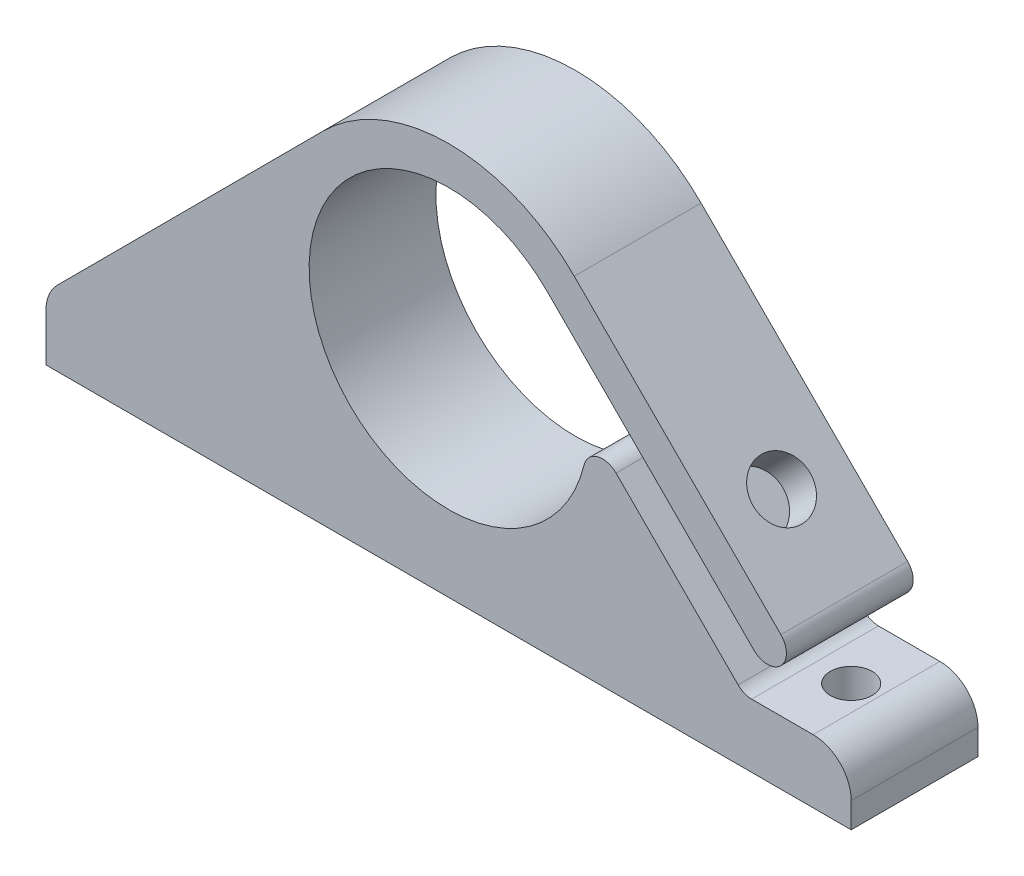
ISO-10303-21;
HEADER;
FILE_DESCRIPTION(('STEP AP214'),'2;1');
FILE_NAME('part.step','',(''),(''),'','','');
FILE_SCHEMA(('AUTOMOTIVE_DESIGN { 1 0 10303 214 1 1 1 1 }'));
ENDSEC;
DATA;
#1=APPLICATION_CONTEXT('core data for automotive mechanical design processes');
#2=APPLICATION_PROTOCOL_DEFINITION('international standard','automotive_design',2000,#1);
#3=PRODUCT_CONTEXT('',#1,'mechanical');
#4=PRODUCT('Part','Part','',(#3));
#5=PRODUCT_RELATED_PRODUCT_CATEGORY('part','',(#4));
#6=PRODUCT_DEFINITION_FORMATION('','',#4);
#7=PRODUCT_DEFINITION_CONTEXT('part definition',#1,'design');
#8=PRODUCT_DEFINITION('design','',#6,#7);
#9=PRODUCT_DEFINITION_SHAPE('','',#8);
#10=(LENGTH_UNIT() NAMED_UNIT(*) SI_UNIT(.MILLI.,.METRE.));
#11=(NAMED_UNIT(*) PLANE_ANGLE_UNIT() SI_UNIT($,.RADIAN.));
#12=(NAMED_UNIT(*) SI_UNIT($,.STERADIAN.) SOLID_ANGLE_UNIT());
#13=UNCERTAINTY_MEASURE_WITH_UNIT(LENGTH_MEASURE(1.E-05),#10,'distance_accuracy_value','');
#14=(GEOMETRIC_REPRESENTATION_CONTEXT(3) GLOBAL_UNCERTAINTY_ASSIGNED_CONTEXT((#13)) GLOBAL_UNIT_ASSIGNED_CONTEXT((#10,
#11,#12)) REPRESENTATION_CONTEXT('',''));
#15=CARTESIAN_POINT('',(0.,0.,0.));
#16=DIRECTION('',(0.,0.,1.));
#17=DIRECTION('',(1.,0.,0.));
#18=AXIS2_PLACEMENT_3D('',#15,#16,#17);
#19=CARTESIAN_POINT('',(0.,0.,10.));
#20=DIRECTION('',(0.,0.,1.));
#21=DIRECTION('',(1.,0.,0.));
#22=AXIS2_PLACEMENT_3D('',#19,#20,#21);
#23=PLANE('',#22);
#24=DIRECTION('',(-0.706314341500663,-0.707898333795528,0.));
#25=VECTOR('',#24,1.);
#26=CARTESIAN_POINT('',(-31.7499999999999,-12.,10.));
#27=LINE('',#26,#25);
#28=CARTESIAN_POINT('',(-9.9105766731374,9.88840078100929,10.));
#29=VERTEX_POINT('',#28);
#30=CARTESIAN_POINT('',(-30.8736950013865,-11.1217297852155,10.));
#31=VERTEX_POINT('',#30);
#32=EDGE_CURVE('E224',#29,#31,#27,.T.);
#33=ORIENTED_EDGE('',*,*,#32,.T.);
#34=CARTESIAN_POINT('',(-28.7499999999999,-13.2406728097175,10.));
#35=DIRECTION('',(0.,0.,1.));
#36=DIRECTION('',(1.,0.,0.));
#37=AXIS2_PLACEMENT_3D('',#34,#35,#36);
#38=CIRCLE('',#37,3.);
#39=CARTESIAN_POINT('',(-31.7499999999999,-13.2406728097175,10.));
#40=VERTEX_POINT('',#39);
#41=EDGE_CURVE('E297',#31,#40,#38,.T.);
#42=ORIENTED_EDGE('',*,*,#41,.T.);
#43=DIRECTION('',(0.,-1.,0.));
#44=VECTOR('',#43,1.);
#45=CARTESIAN_POINT('',(-31.7499999999999,-12.,10.));
#46=LINE('',#45,#44);
#47=CARTESIAN_POINT('',(-31.7499999999999,-17.,10.));
#48=VERTEX_POINT('',#47);
#49=EDGE_CURVE('E227',#40,#48,#46,.T.);
#50=ORIENTED_EDGE('',*,*,#49,.T.);
#51=DIRECTION('',(1.,0.,0.));
#52=VECTOR('',#51,1.);
#53=CARTESIAN_POINT('',(-31.7499999999999,-17.,10.));
#54=LINE('',#53,#52);
#55=CARTESIAN_POINT('',(31.7500000000001,-17.,10.));
#56=VERTEX_POINT('',#55);
#57=EDGE_CURVE('E229',#48,#56,#54,.T.);
#58=ORIENTED_EDGE('',*,*,#57,.T.);
#59=DIRECTION('',(0.,1.,0.));
#60=VECTOR('',#59,1.);
#61=CARTESIAN_POINT('',(31.7500000000001,-12.,10.));
#62=LINE('',#61,#60);
#63=CARTESIAN_POINT('',(31.7500000000001,-15.,10.));
#64=VERTEX_POINT('',#63);
#65=EDGE_CURVE('E217',#56,#64,#62,.T.);
#66=ORIENTED_EDGE('',*,*,#65,.T.);
#67=CARTESIAN_POINT('',(28.7500000000001,-15.,10.));
#68=DIRECTION('',(0.,0.,1.));
#69=DIRECTION('',(1.,0.,0.));
#70=AXIS2_PLACEMENT_3D('',#67,#68,#69);
#71=CIRCLE('',#70,3.);
#72=CARTESIAN_POINT('',(28.7500000000001,-12.,10.));
#73=VERTEX_POINT('',#72);
#74=EDGE_CURVE('E55',#64,#73,#71,.T.);
#75=ORIENTED_EDGE('',*,*,#74,.T.);
#76=DIRECTION('',(1.,0.,0.));
#77=VECTOR('',#76,1.);
#78=CARTESIAN_POINT('',(31.7500000000001,-12.,10.));
#79=LINE('',#78,#77);
#80=CARTESIAN_POINT('',(23.8965113748145,-12.,10.));
#81=VERTEX_POINT('',#80);
#82=EDGE_CURVE('E205',#81,#73,#79,.T.);
#83=ORIENTED_EDGE('',*,*,#82,.F.);
#84=CARTESIAN_POINT('',(23.8965113748145,-10.5,10.));
#85=DIRECTION('',(0.,0.,1.));
#86=DIRECTION('',(1.,0.,0.));
#87=AXIS2_PLACEMENT_3D('',#84,#85,#86);
#88=CIRCLE('',#87,1.5);
#89=CARTESIAN_POINT('',(22.8346638741212,-11.559471512251,10.));
#90=VERTEX_POINT('',#89);
#91=EDGE_CURVE('E281',#81,#90,#88,.F.);
#92=ORIENTED_EDGE('',*,*,#91,.T.);
#93=DIRECTION('',(0.706314341500665,-0.707898333795526,0.));
#94=VECTOR('',#93,1.);
#95=CARTESIAN_POINT('',(10.9957430079515,0.305999514845082,10.));
#96=LINE('',#95,#94);
#97=CARTESIAN_POINT('',(13.2045601650988,-1.90777117241208,10.));
#98=VERTEX_POINT('',#97);
#99=EDGE_CURVE('E202',#98,#90,#96,.T.);
#100=ORIENTED_EDGE('',*,*,#99,.F.);
#101=CARTESIAN_POINT('',(12.1427126644055,-2.96724268466308,10.));
#102=DIRECTION('',(0.,0.,1.));
#103=DIRECTION('',(1.,0.,0.));
#104=AXIS2_PLACEMENT_3D('',#101,#102,#103);
#105=CIRCLE('',#104,1.5);
#106=CARTESIAN_POINT('',(10.6855871446768,-2.61117356250351,10.));
#107=VERTEX_POINT('',#106);
#108=EDGE_CURVE('E263',#98,#107,#105,.T.);
#109=ORIENTED_EDGE('',*,*,#108,.T.);
#110=CARTESIAN_POINT('',(0.,0.,10.));
#111=DIRECTION('',(0.,0.,1.));
#112=DIRECTION('',(1.,0.,0.));
#113=AXIS2_PLACEMENT_3D('',#110,#111,#112);
#114=CIRCLE('',#113,11.);
#115=CARTESIAN_POINT('',(7.78688167175078,7.76945775650732,10.));
#116=VERTEX_POINT('',#115);
#117=EDGE_CURVE('E211',#116,#107,#114,.T.);
#118=ORIENTED_EDGE('',*,*,#117,.F.);
#119=DIRECTION('',(-0.706314341500666,0.707898333795526,0.));
#120=VECTOR('',#119,1.);
#121=CARTESIAN_POINT('',(7.78688167175078,7.76945775650732,10.));
#122=LINE('',#121,#120);
#123=CARTESIAN_POINT('',(24.0792733518326,-8.559471512251,10.));
#124=VERTEX_POINT('',#123);
#125=EDGE_CURVE('E196',#124,#116,#122,.T.);
#126=ORIENTED_EDGE('',*,*,#125,.F.);
#127=CARTESIAN_POINT('',(25.1411208525258,-7.49999999999999,10.));
#128=DIRECTION('',(0.,0.,1.));
#129=DIRECTION('',(1.,0.,0.));
#130=AXIS2_PLACEMENT_3D('',#127,#128,#129);
#131=CIRCLE('',#130,1.5);
#132=CARTESIAN_POINT('',(25.1411208525259,-8.99999999999999,10.));
#133=VERTEX_POINT('',#132);
#134=EDGE_CURVE('E259',#124,#133,#131,.T.);
#135=ORIENTED_EDGE('',*,*,#134,.T.);
#136=CARTESIAN_POINT('',(25.1411208525258,-7.49999999999999,10.));
#137=DIRECTION('',(0.,0.,1.));
#138=DIRECTION('',(1.,0.,0.));
#139=AXIS2_PLACEMENT_3D('',#136,#137,#138);
#140=CIRCLE('',#139,1.5);
#141=CARTESIAN_POINT('',(26.2029683532191,-6.44052848774899,10.));
#142=VERTEX_POINT('',#141);
#143=EDGE_CURVE('E261',#133,#142,#140,.T.);
#144=ORIENTED_EDGE('',*,*,#143,.T.);
#145=DIRECTION('',(-0.706314341500666,0.707898333795526,0.));
#146=VECTOR('',#145,1.);
#147=CARTESIAN_POINT('',(31.7500000000001,-12.,10.));
#148=LINE('',#147,#146);
#149=CARTESIAN_POINT('',(9.91057667313737,9.88840078100932,10.));
#150=VERTEX_POINT('',#149);
#151=EDGE_CURVE('E219',#142,#150,#148,.T.);
#152=ORIENTED_EDGE('',*,*,#151,.T.);
#153=CARTESIAN_POINT('',(0.,0.,10.));
#154=DIRECTION('',(0.,0.,1.));
#155=DIRECTION('',(1.,0.,0.));
#156=AXIS2_PLACEMENT_3D('',#153,#154,#155);
#157=CIRCLE('',#156,14.);
#158=EDGE_CURVE('E222',#150,#29,#157,.T.);
#159=ORIENTED_EDGE('',*,*,#158,.T.);
#160=EDGE_LOOP('',(#33,#42,#50,#58,#66,#75,#83,#92,#100,#109,#118,#126,#135,#144,#152,#159));
#161=FACE_BOUND('',#160,.T.);
#162=ADVANCED_FACE('F40',(#161),#23,.T.);
#163=CARTESIAN_POINT('',(0.,0.,0.));
#164=DIRECTION('',(0.,0.,1.));
#165=DIRECTION('',(1.,0.,0.));
#166=AXIS2_PLACEMENT_3D('',#163,#164,#165);
#167=PLANE('',#166);
#168=DIRECTION('',(0.,-1.,0.));
#169=VECTOR('',#168,1.);
#170=CARTESIAN_POINT('',(-31.7499999999999,-12.,0.));
#171=LINE('',#170,#169);
#172=CARTESIAN_POINT('',(-31.7499999999999,-13.2406728097175,0.));
#173=VERTEX_POINT('',#172);
#174=CARTESIAN_POINT('',(-31.7499999999999,-17.,0.));
#175=VERTEX_POINT('',#174);
#176=EDGE_CURVE('E240',#173,#175,#171,.T.);
#177=ORIENTED_EDGE('',*,*,#176,.F.);
#178=CARTESIAN_POINT('',(-28.7499999999999,-13.2406728097175,0.));
#179=DIRECTION('',(0.,0.,1.));
#180=DIRECTION('',(1.,0.,0.));
#181=AXIS2_PLACEMENT_3D('',#178,#179,#180);
#182=CIRCLE('',#181,3.);
#183=CARTESIAN_POINT('',(-30.8736950013865,-11.1217297852155,0.));
#184=VERTEX_POINT('',#183);
#185=EDGE_CURVE('E292',#173,#184,#182,.F.);
#186=ORIENTED_EDGE('',*,*,#185,.T.);
#187=DIRECTION('',(-0.706314341500663,-0.707898333795528,0.));
#188=VECTOR('',#187,1.);
#189=CARTESIAN_POINT('',(-31.7499999999999,-12.,0.));
#190=LINE('',#189,#188);
#191=CARTESIAN_POINT('',(-9.9105766731374,9.88840078100929,0.));
#192=VERTEX_POINT('',#191);
#193=EDGE_CURVE('E237',#192,#184,#190,.T.);
#194=ORIENTED_EDGE('',*,*,#193,.F.);
#195=CARTESIAN_POINT('',(0.,0.,0.));
#196=DIRECTION('',(0.,0.,1.));
#197=DIRECTION('',(1.,0.,0.));
#198=AXIS2_PLACEMENT_3D('',#195,#196,#197);
#199=CIRCLE('',#198,14.);
#200=CARTESIAN_POINT('',(9.91057667313737,9.88840078100932,0.));
#201=VERTEX_POINT('',#200);
#202=EDGE_CURVE('E235',#201,#192,#199,.T.);
#203=ORIENTED_EDGE('',*,*,#202,.F.);
#204=DIRECTION('',(-0.706314341500666,0.707898333795526,0.));
#205=VECTOR('',#204,1.);
#206=CARTESIAN_POINT('',(31.7500000000001,-12.,0.));
#207=LINE('',#206,#205);
#208=CARTESIAN_POINT('',(26.2029683532191,-6.44052848774899,0.));
#209=VERTEX_POINT('',#208);
#210=EDGE_CURVE('E233',#209,#201,#207,.T.);
#211=ORIENTED_EDGE('',*,*,#210,.F.);
#212=CARTESIAN_POINT('',(25.1411208525258,-7.49999999999999,0.));
#213=DIRECTION('',(0.,0.,1.));
#214=DIRECTION('',(1.,0.,0.));
#215=AXIS2_PLACEMENT_3D('',#212,#213,#214);
#216=CIRCLE('',#215,1.5);
#217=CARTESIAN_POINT('',(25.1411208525259,-8.99999999999999,0.));
#218=VERTEX_POINT('',#217);
#219=EDGE_CURVE('E269',#209,#218,#216,.F.);
#220=ORIENTED_EDGE('',*,*,#219,.T.);
#221=CARTESIAN_POINT('',(25.1411208525258,-7.49999999999999,0.));
#222=DIRECTION('',(0.,0.,1.));
#223=DIRECTION('',(1.,0.,0.));
#224=AXIS2_PLACEMENT_3D('',#221,#222,#223);
#225=CIRCLE('',#224,1.5);
#226=CARTESIAN_POINT('',(24.0792733518326,-8.559471512251,0.));
#227=VERTEX_POINT('',#226);
#228=EDGE_CURVE('E267',#218,#227,#225,.F.);
#229=ORIENTED_EDGE('',*,*,#228,.T.);
#230=DIRECTION('',(-0.706314341500666,0.707898333795526,0.));
#231=VECTOR('',#230,1.);
#232=CARTESIAN_POINT('',(7.78688167175078,7.76945775650732,0.));
#233=LINE('',#232,#231);
#234=CARTESIAN_POINT('',(7.78688167175078,7.76945775650732,0.));
#235=VERTEX_POINT('',#234);
#236=EDGE_CURVE('E199',#227,#235,#233,.T.);
#237=ORIENTED_EDGE('',*,*,#236,.T.);
#238=CARTESIAN_POINT('',(0.,0.,0.));
#239=DIRECTION('',(0.,0.,1.));
#240=DIRECTION('',(1.,0.,0.));
#241=AXIS2_PLACEMENT_3D('',#238,#239,#240);
#242=CIRCLE('',#241,11.);
#243=CARTESIAN_POINT('',(10.6855871446768,-2.61117356250351,0.));
#244=VERTEX_POINT('',#243);
#245=EDGE_CURVE('E210',#235,#244,#242,.T.);
#246=ORIENTED_EDGE('',*,*,#245,.T.);
#247=CARTESIAN_POINT('',(12.1427126644055,-2.96724268466308,0.));
#248=DIRECTION('',(0.,0.,1.));
#249=DIRECTION('',(1.,0.,0.));
#250=AXIS2_PLACEMENT_3D('',#247,#248,#249);
#251=CIRCLE('',#250,1.5);
#252=CARTESIAN_POINT('',(13.2045601650988,-1.90777117241208,0.));
#253=VERTEX_POINT('',#252);
#254=EDGE_CURVE('E271',#244,#253,#251,.F.);
#255=ORIENTED_EDGE('',*,*,#254,.T.);
#256=DIRECTION('',(0.706314341500665,-0.707898333795526,0.));
#257=VECTOR('',#256,1.);
#258=CARTESIAN_POINT('',(10.9957430079515,0.305999514845082,0.));
#259=LINE('',#258,#257);
#260=CARTESIAN_POINT('',(22.8346638741212,-11.559471512251,0.));
#261=VERTEX_POINT('',#260);
#262=EDGE_CURVE('E192',#253,#261,#259,.T.);
#263=ORIENTED_EDGE('',*,*,#262,.T.);
#264=CARTESIAN_POINT('',(23.8965113748145,-10.5,0.));
#265=DIRECTION('',(0.,0.,1.));
#266=DIRECTION('',(1.,0.,0.));
#267=AXIS2_PLACEMENT_3D('',#264,#265,#266);
#268=CIRCLE('',#267,1.5);
#269=CARTESIAN_POINT('',(23.8965113748145,-12.,0.));
#270=VERTEX_POINT('',#269);
#271=EDGE_CURVE('E283',#261,#270,#268,.T.);
#272=ORIENTED_EDGE('',*,*,#271,.T.);
#273=DIRECTION('',(1.,0.,0.));
#274=VECTOR('',#273,1.);
#275=CARTESIAN_POINT('',(31.7500000000001,-12.,0.));
#276=LINE('',#275,#274);
#277=CARTESIAN_POINT('',(28.7500000000001,-12.,0.));
#278=VERTEX_POINT('',#277);
#279=EDGE_CURVE('E195',#270,#278,#276,.T.);
#280=ORIENTED_EDGE('',*,*,#279,.T.);
#281=CARTESIAN_POINT('',(28.7500000000001,-15.,0.));
#282=DIRECTION('',(0.,0.,1.));
#283=DIRECTION('',(1.,0.,0.));
#284=AXIS2_PLACEMENT_3D('',#281,#282,#283);
#285=CIRCLE('',#284,3.);
#286=CARTESIAN_POINT('',(31.7500000000001,-15.,0.));
#287=VERTEX_POINT('',#286);
#288=EDGE_CURVE('E290',#278,#287,#285,.F.);
#289=ORIENTED_EDGE('',*,*,#288,.T.);
#290=DIRECTION('',(0.,1.,0.));
#291=VECTOR('',#290,1.);
#292=CARTESIAN_POINT('',(31.7500000000001,-12.,0.));
#293=LINE('',#292,#291);
#294=CARTESIAN_POINT('',(31.7500000000001,-17.,0.));
#295=VERTEX_POINT('',#294);
#296=EDGE_CURVE('E214',#295,#287,#293,.T.);
#297=ORIENTED_EDGE('',*,*,#296,.F.);
#298=DIRECTION('',(1.,0.,0.));
#299=VECTOR('',#298,1.);
#300=CARTESIAN_POINT('',(-31.7499999999999,-17.,0.));
#301=LINE('',#300,#299);
#302=EDGE_CURVE('E220',#175,#295,#301,.T.);
#303=ORIENTED_EDGE('',*,*,#302,.F.);
#304=EDGE_LOOP('',(#177,#186,#194,#203,#211,#220,#229,#237,#246,#255,#263,#272,#280,#289,#297,#303));
#305=FACE_BOUND('',#304,.T.);
#306=ADVANCED_FACE('F307',(#305),#167,.F.);
#307=CARTESIAN_POINT('',(31.7500000000001,-12.,10.));
#308=DIRECTION('',(-1.,0.,0.));
#309=DIRECTION('',(0.,0.,1.));
#310=AXIS2_PLACEMENT_3D('',#307,#308,#309);
#311=PLANE('',#310);
#312=ORIENTED_EDGE('',*,*,#296,.T.);
#313=DIRECTION('',(0.,0.,-1.));
#314=VECTOR('',#313,1.);
#315=CARTESIAN_POINT('',(31.7500000000001,-15.,10.));
#316=LINE('',#315,#314);
#317=EDGE_CURVE('E11',#287,#64,#316,.F.);
#318=ORIENTED_EDGE('',*,*,#317,.T.);
#319=ORIENTED_EDGE('',*,*,#65,.F.);
#320=DIRECTION('',(0.,0.,-1.));
#321=VECTOR('',#320,1.);
#322=CARTESIAN_POINT('',(31.7500000000001,-17.,10.));
#323=LINE('',#322,#321);
#324=EDGE_CURVE('E231',#56,#295,#323,.T.);
#325=ORIENTED_EDGE('',*,*,#324,.T.);
#326=EDGE_LOOP('',(#312,#318,#319,#325));
#327=FACE_BOUND('',#326,.T.);
#328=ADVANCED_FACE('F368',(#327),#311,.F.);
#329=CARTESIAN_POINT('',(31.7500000000001,-12.,10.));
#330=DIRECTION('',(-0.707898333795526,-0.706314341500666,0.));
#331=DIRECTION('',(0.706314341500666,-0.707898333795526,0.));
#332=AXIS2_PLACEMENT_3D('',#329,#330,#331);
#333=PLANE('',#332);
#334=CARTESIAN_POINT('',(21.2587679627145,-1.48524015118031,5.));
#335=DIRECTION('',(0.707898333795525,0.706314341500666,0.));
#336=DIRECTION('',(-0.706314341500666,0.707898333795525,0.));
#337=AXIS2_PLACEMENT_3D('',#334,#335,#336);
#338=CIRCLE('',#337,2.24999999999999);
#339=CARTESIAN_POINT('',(19.669560694338,0.107531099859614,5.));
#340=VERTEX_POINT('',#339);
#341=EDGE_CURVE('E168',#340,#340,#338,.T.);
#342=ORIENTED_EDGE('',*,*,#341,.F.);
#343=EDGE_LOOP('',(#342));
#344=FACE_BOUND('',#343,.T.);
#345=ORIENTED_EDGE('',*,*,#151,.F.);
#346=DIRECTION('',(0.,0.,-1.));
#347=VECTOR('',#346,1.);
#348=CARTESIAN_POINT('',(26.2029683532191,-6.44052848774899,10.));
#349=LINE('',#348,#347);
#350=EDGE_CURVE('E273',#142,#209,#349,.T.);
#351=ORIENTED_EDGE('',*,*,#350,.T.);
#352=ORIENTED_EDGE('',*,*,#210,.T.);
#353=DIRECTION('',(0.,0.,-1.));
#354=VECTOR('',#353,1.);
#355=CARTESIAN_POINT('',(9.91057667313737,9.88840078100932,10.));
#356=LINE('',#355,#354);
#357=EDGE_CURVE('E251',#150,#201,#356,.T.);
#358=ORIENTED_EDGE('',*,*,#357,.F.);
#359=EDGE_LOOP('',(#345,#351,#352,#358));
#360=FACE_BOUND('',#359,.T.);
#361=ADVANCED_FACE('F344',(#344,#360),#333,.F.);
#362=CARTESIAN_POINT('',(0.,0.,10.));
#363=DIRECTION('',(0.,0.,-1.));
#364=DIRECTION('',(-1.,0.,0.));
#365=AXIS2_PLACEMENT_3D('',#362,#363,#364);
#366=CYLINDRICAL_SURFACE('',#365,14.);
#367=ORIENTED_EDGE('',*,*,#202,.T.);
#368=DIRECTION('',(0.,0.,-1.));
#369=VECTOR('',#368,1.);
#370=CARTESIAN_POINT('',(-9.9105766731374,9.88840078100929,10.));
#371=LINE('',#370,#369);
#372=EDGE_CURVE('E248',#29,#192,#371,.T.);
#373=ORIENTED_EDGE('',*,*,#372,.F.);
#374=ORIENTED_EDGE('',*,*,#158,.F.);
#375=ORIENTED_EDGE('',*,*,#357,.T.);
#376=EDGE_LOOP('',(#367,#373,#374,#375));
#377=FACE_BOUND('',#376,.T.);
#378=ADVANCED_FACE('F350',(#377),#366,.T.);
#379=CARTESIAN_POINT('',(-31.7499999999999,-12.,10.));
#380=DIRECTION('',(0.707898333795528,-0.706314341500663,0.));
#381=DIRECTION('',(0.706314341500663,0.707898333795528,0.));
#382=AXIS2_PLACEMENT_3D('',#379,#380,#381);
#383=PLANE('',#382);
#384=ORIENTED_EDGE('',*,*,#193,.T.);
#385=DIRECTION('',(0.,0.,-1.));
#386=VECTOR('',#385,1.);
#387=CARTESIAN_POINT('',(-30.8736950013865,-11.1217297852155,10.));
#388=LINE('',#387,#386);
#389=EDGE_CURVE('E294',#184,#31,#388,.F.);
#390=ORIENTED_EDGE('',*,*,#389,.T.);
#391=ORIENTED_EDGE('',*,*,#32,.F.);
#392=ORIENTED_EDGE('',*,*,#372,.T.);
#393=EDGE_LOOP('',(#384,#390,#391,#392));
#394=FACE_BOUND('',#393,.T.);
#395=ADVANCED_FACE('F387',(#394),#383,.F.);
#396=CARTESIAN_POINT('',(-31.7499999999999,-12.,10.));
#397=DIRECTION('',(1.,0.,0.));
#398=DIRECTION('',(0.,0.,-1.));
#399=AXIS2_PLACEMENT_3D('',#396,#397,#398);
#400=PLANE('',#399);
#401=ORIENTED_EDGE('',*,*,#49,.F.);
#402=DIRECTION('',(0.,0.,-1.));
#403=VECTOR('',#402,1.);
#404=CARTESIAN_POINT('',(-31.7499999999999,-13.2406728097175,10.));
#405=LINE('',#404,#403);
#406=EDGE_CURVE('E285',#40,#173,#405,.T.);
#407=ORIENTED_EDGE('',*,*,#406,.T.);
#408=ORIENTED_EDGE('',*,*,#176,.T.);
#409=DIRECTION('',(0.,0.,-1.));
#410=VECTOR('',#409,1.);
#411=CARTESIAN_POINT('',(-31.7499999999999,-17.,10.));
#412=LINE('',#411,#410);
#413=EDGE_CURVE('E245',#48,#175,#412,.T.);
#414=ORIENTED_EDGE('',*,*,#413,.F.);
#415=EDGE_LOOP('',(#401,#407,#408,#414));
#416=FACE_BOUND('',#415,.T.);
#417=ADVANCED_FACE('F360',(#416),#400,.F.);
#418=CARTESIAN_POINT('',(-31.7499999999999,-17.,10.));
#419=DIRECTION('',(0.,1.,0.));
#420=DIRECTION('',(0.,0.,1.));
#421=AXIS2_PLACEMENT_3D('',#418,#419,#420);
#422=PLANE('',#421);
#423=CARTESIAN_POINT('',(-26.7499999999999,-17.,5.));
#424=DIRECTION('',(0.,-1.,0.));
#425=DIRECTION('',(0.,0.,-1.));
#426=AXIS2_PLACEMENT_3D('',#423,#424,#425);
#427=CIRCLE('',#426,1.64999999999999);
#428=CARTESIAN_POINT('',(-26.7499999999999,-17.,3.35000000000001));
#429=VERTEX_POINT('',#428);
#430=EDGE_CURVE('E179',#429,#429,#427,.T.);
#431=ORIENTED_EDGE('',*,*,#430,.F.);
#432=EDGE_LOOP('',(#431));
#433=FACE_BOUND('',#432,.T.);
#434=CARTESIAN_POINT('',(26.7500000000001,-17.,5.));
#435=DIRECTION('',(0.,-1.,0.));
#436=DIRECTION('',(0.,0.,-1.));
#437=AXIS2_PLACEMENT_3D('',#434,#435,#436);
#438=CIRCLE('',#437,1.64999999999999);
#439=CARTESIAN_POINT('',(26.7500000000001,-17.,3.35000000000001));
#440=VERTEX_POINT('',#439);
#441=EDGE_CURVE('E185',#440,#440,#438,.T.);
#442=ORIENTED_EDGE('',*,*,#441,.F.);
#443=EDGE_LOOP('',(#442));
#444=FACE_BOUND('',#443,.T.);
#445=ORIENTED_EDGE('',*,*,#302,.T.);
#446=ORIENTED_EDGE('',*,*,#324,.F.);
#447=ORIENTED_EDGE('',*,*,#57,.F.);
#448=ORIENTED_EDGE('',*,*,#413,.T.);
#449=EDGE_LOOP('',(#445,#446,#447,#448));
#450=FACE_BOUND('',#449,.T.);
#451=ADVANCED_FACE('F366',(#433,#444,#450),#422,.F.);
#452=CARTESIAN_POINT('',(0.,0.,10.));
#453=DIRECTION('',(0.,0.,-1.));
#454=DIRECTION('',(-1.,0.,0.));
#455=AXIS2_PLACEMENT_3D('',#452,#453,#454);
#456=CYLINDRICAL_SURFACE('',#455,11.);
#457=ORIENTED_EDGE('',*,*,#117,.T.);
#458=DIRECTION('',(0.,0.,-1.));
#459=VECTOR('',#458,1.);
#460=CARTESIAN_POINT('',(10.6855871446768,-2.61117356250351,10.));
#461=LINE('',#460,#459);
#462=EDGE_CURVE('E265',#107,#244,#461,.T.);
#463=ORIENTED_EDGE('',*,*,#462,.T.);
#464=ORIENTED_EDGE('',*,*,#245,.F.);
#465=DIRECTION('',(0.,0.,1.));
#466=VECTOR('',#465,1.);
#467=CARTESIAN_POINT('',(7.78688167175078,7.76945775650732,0.));
#468=LINE('',#467,#466);
#469=EDGE_CURVE('E201',#235,#116,#468,.T.);
#470=ORIENTED_EDGE('',*,*,#469,.T.);
#471=EDGE_LOOP('',(#457,#463,#464,#470));
#472=FACE_BOUND('',#471,.T.);
#473=ADVANCED_FACE('F325',(#472),#456,.F.);
#474=CARTESIAN_POINT('',(10.9957430079515,0.305999514845082,0.));
#475=DIRECTION('',(-0.707898333795526,-0.706314341500665,0.));
#476=DIRECTION('',(0.706314341500665,-0.707898333795526,0.));
#477=AXIS2_PLACEMENT_3D('',#474,#475,#476);
#478=PLANE('',#477);
#479=CARTESIAN_POINT('',(17.0113779599413,-5.72312620018431,5.));
#480=DIRECTION('',(0.707898333795526,0.706314341500665,0.));
#481=DIRECTION('',(-0.706314341500665,0.707898333795526,0.));
#482=AXIS2_PLACEMENT_3D('',#479,#480,#481);
#483=CIRCLE('',#482,1.64999999999999);
#484=CARTESIAN_POINT('',(15.8459592964652,-4.5550939494217,5.));
#485=VERTEX_POINT('',#484);
#486=EDGE_CURVE('E169',#485,#485,#483,.T.);
#487=ORIENTED_EDGE('',*,*,#486,.F.);
#488=EDGE_LOOP('',(#487));
#489=FACE_BOUND('',#488,.T.);
#490=ORIENTED_EDGE('',*,*,#262,.F.);
#491=DIRECTION('',(0.,0.,1.));
#492=VECTOR('',#491,1.);
#493=CARTESIAN_POINT('',(13.2045601650988,-1.90777117241208,10.));
#494=LINE('',#493,#492);
#495=EDGE_CURVE('E256',#253,#98,#494,.T.);
#496=ORIENTED_EDGE('',*,*,#495,.T.);
#497=ORIENTED_EDGE('',*,*,#99,.T.);
#498=DIRECTION('',(0.,0.,1.));
#499=VECTOR('',#498,1.);
#500=CARTESIAN_POINT('',(22.8346638741212,-11.559471512251,0.));
#501=LINE('',#500,#499);
#502=EDGE_CURVE('E254',#90,#261,#501,.F.);
#503=ORIENTED_EDGE('',*,*,#502,.T.);
#504=EDGE_LOOP('',(#490,#496,#497,#503));
#505=FACE_BOUND('',#504,.T.);
#506=ADVANCED_FACE('F316',(#489,#505),#478,.F.);
#507=CARTESIAN_POINT('',(31.7500000000001,-12.,0.));
#508=DIRECTION('',(0.,-1.,0.));
#509=DIRECTION('',(0.,0.,-1.));
#510=AXIS2_PLACEMENT_3D('',#507,#508,#509);
#511=PLANE('',#510);
#512=CARTESIAN_POINT('',(26.7500000000001,-12.,5.));
#513=DIRECTION('',(0.,-1.,0.));
#514=DIRECTION('',(0.,0.,-1.));
#515=AXIS2_PLACEMENT_3D('',#512,#513,#514);
#516=CIRCLE('',#515,1.65);
#517=CARTESIAN_POINT('',(26.7500000000001,-12.,3.35));
#518=VERTEX_POINT('',#517);
#519=EDGE_CURVE('E188',#518,#518,#516,.T.);
#520=ORIENTED_EDGE('',*,*,#519,.T.);
#521=EDGE_LOOP('',(#520));
#522=FACE_BOUND('',#521,.T.);
#523=ORIENTED_EDGE('',*,*,#82,.T.);
#524=DIRECTION('',(0.,0.,-1.));
#525=VECTOR('',#524,1.);
#526=CARTESIAN_POINT('',(28.7500000000001,-12.,0.));
#527=LINE('',#526,#525);
#528=EDGE_CURVE('E48',#73,#278,#527,.T.);
#529=ORIENTED_EDGE('',*,*,#528,.T.);
#530=ORIENTED_EDGE('',*,*,#279,.F.);
#531=DIRECTION('',(0.,0.,1.));
#532=VECTOR('',#531,1.);
#533=CARTESIAN_POINT('',(23.8965113748145,-12.,10.));
#534=LINE('',#533,#532);
#535=EDGE_CURVE('E276',#270,#81,#534,.T.);
#536=ORIENTED_EDGE('',*,*,#535,.T.);
#537=EDGE_LOOP('',(#523,#529,#530,#536));
#538=FACE_BOUND('',#537,.T.);
#539=ADVANCED_FACE('F302',(#522,#538),#511,.F.);
#540=CARTESIAN_POINT('',(7.78688167175078,7.76945775650732,0.));
#541=DIRECTION('',(0.707898333795526,0.706314341500666,0.));
#542=DIRECTION('',(-0.706314341500666,0.707898333795526,0.));
#543=AXIS2_PLACEMENT_3D('',#540,#541,#542);
#544=PLANE('',#543);
#545=CARTESIAN_POINT('',(19.1350729613279,-3.60418317568231,5.));
#546=DIRECTION('',(0.707898333795526,0.706314341500666,0.));
#547=DIRECTION('',(-0.706314341500666,0.707898333795526,0.));
#548=AXIS2_PLACEMENT_3D('',#545,#546,#547);
#549=CIRCLE('',#548,2.24999999999999);
#550=CARTESIAN_POINT('',(17.5458656929514,-2.01141192464238,5.));
#551=VERTEX_POINT('',#550);
#552=EDGE_CURVE('E172',#551,#551,#549,.T.);
#553=ORIENTED_EDGE('',*,*,#552,.T.);
#554=EDGE_LOOP('',(#553));
#555=FACE_BOUND('',#554,.T.);
#556=ORIENTED_EDGE('',*,*,#236,.F.);
#557=DIRECTION('',(0.,0.,1.));
#558=VECTOR('',#557,1.);
#559=CARTESIAN_POINT('',(24.0792733518326,-8.559471512251,0.));
#560=LINE('',#559,#558);
#561=EDGE_CURVE('E279',#227,#124,#560,.T.);
#562=ORIENTED_EDGE('',*,*,#561,.T.);
#563=ORIENTED_EDGE('',*,*,#125,.T.);
#564=ORIENTED_EDGE('',*,*,#469,.F.);
#565=EDGE_LOOP('',(#556,#562,#563,#564));
#566=FACE_BOUND('',#565,.T.);
#567=ADVANCED_FACE('F330',(#555,#566),#544,.F.);
#568=CARTESIAN_POINT('',(12.1427126644055,-2.96724268466308,10.));
#569=DIRECTION('',(0.,0.,-1.));
#570=DIRECTION('',(-1.,0.,0.));
#571=AXIS2_PLACEMENT_3D('',#568,#569,#570);
#572=CYLINDRICAL_SURFACE('',#571,1.5);
#573=ORIENTED_EDGE('',*,*,#254,.F.);
#574=ORIENTED_EDGE('',*,*,#462,.F.);
#575=ORIENTED_EDGE('',*,*,#108,.F.);
#576=ORIENTED_EDGE('',*,*,#495,.F.);
#577=EDGE_LOOP('',(#573,#574,#575,#576));
#578=FACE_BOUND('',#577,.T.);
#579=ADVANCED_FACE('F320',(#578),#572,.T.);
#580=CARTESIAN_POINT('',(25.1411208525258,-7.49999999999999,0.));
#581=DIRECTION('',(0.,0.,1.));
#582=DIRECTION('',(1.,0.,0.));
#583=AXIS2_PLACEMENT_3D('',#580,#581,#582);
#584=CYLINDRICAL_SURFACE('',#583,1.5);
#585=DIRECTION('',(0.,0.,1.));
#586=VECTOR('',#585,1.);
#587=CARTESIAN_POINT('',(25.1411208525258,-8.99999999999999,0.));
#588=LINE('',#587,#586);
#589=EDGE_CURVE('E191',#133,#218,#588,.F.);
#590=ORIENTED_EDGE('',*,*,#589,.F.);
#591=ORIENTED_EDGE('',*,*,#134,.F.);
#592=ORIENTED_EDGE('',*,*,#561,.F.);
#593=ORIENTED_EDGE('',*,*,#228,.F.);
#594=EDGE_LOOP('',(#590,#591,#592,#593));
#595=FACE_BOUND('',#594,.T.);
#596=ADVANCED_FACE('F335',(#595),#584,.T.);
#597=CARTESIAN_POINT('',(25.1411208525258,-7.49999999999999,10.));
#598=DIRECTION('',(0.,0.,-1.));
#599=DIRECTION('',(-1.,0.,0.));
#600=AXIS2_PLACEMENT_3D('',#597,#598,#599);
#601=CYLINDRICAL_SURFACE('',#600,1.5);
#602=ORIENTED_EDGE('',*,*,#143,.F.);
#603=ORIENTED_EDGE('',*,*,#589,.T.);
#604=ORIENTED_EDGE('',*,*,#219,.F.);
#605=ORIENTED_EDGE('',*,*,#350,.F.);
#606=EDGE_LOOP('',(#602,#603,#604,#605));
#607=FACE_BOUND('',#606,.T.);
#608=ADVANCED_FACE('F340',(#607),#601,.T.);
#609=CARTESIAN_POINT('',(23.8965113748145,-10.5,0.));
#610=DIRECTION('',(0.,0.,-1.));
#611=DIRECTION('',(-1.,0.,0.));
#612=AXIS2_PLACEMENT_3D('',#609,#610,#611);
#613=CYLINDRICAL_SURFACE('',#612,1.5);
#614=ORIENTED_EDGE('',*,*,#271,.F.);
#615=ORIENTED_EDGE('',*,*,#502,.F.);
#616=ORIENTED_EDGE('',*,*,#91,.F.);
#617=ORIENTED_EDGE('',*,*,#535,.F.);
#618=EDGE_LOOP('',(#614,#615,#616,#617));
#619=FACE_BOUND('',#618,.T.);
#620=ADVANCED_FACE('F313',(#619),#613,.F.);
#621=CARTESIAN_POINT('',(26.7500000000001,-17.,5.));
#622=DIRECTION('',(0.,-1.,0.));
#623=DIRECTION('',(0.,0.,-1.));
#624=AXIS2_PLACEMENT_3D('',#621,#622,#623);
#625=CYLINDRICAL_SURFACE('',#624,1.65);
#626=ORIENTED_EDGE('',*,*,#519,.F.);
#627=EDGE_LOOP('',(#626));
#628=FACE_BOUND('',#627,.T.);
#629=ORIENTED_EDGE('',*,*,#441,.T.);
#630=EDGE_LOOP('',(#629));
#631=FACE_BOUND('',#630,.T.);
#632=ADVANCED_FACE('F404',(#628,#631),#625,.F.);
#633=CARTESIAN_POINT('',(-26.7499999999999,-12.,5.));
#634=DIRECTION('',(0.,-1.,0.));
#635=DIRECTION('',(0.,0.,-1.));
#636=AXIS2_PLACEMENT_3D('',#633,#634,#635);
#637=CONICAL_SURFACE('',#636,1.65,1.02974425867666);
#638=CARTESIAN_POINT('',(-26.7499999999999,-11.0085799786045,5.));
#639=VERTEX_POINT('',#638);
#640=VERTEX_LOOP('',#639);
#641=FACE_BOUND('',#640,.T.);
#642=CARTESIAN_POINT('',(-26.7499999999999,-12.,5.));
#643=DIRECTION('',(0.,-1.,0.));
#644=DIRECTION('',(0.,0.,-1.));
#645=AXIS2_PLACEMENT_3D('',#642,#643,#644);
#646=CIRCLE('',#645,1.65);
#647=CARTESIAN_POINT('',(-26.7499999999999,-12.,3.35));
#648=VERTEX_POINT('',#647);
#649=EDGE_CURVE('E182',#648,#648,#646,.T.);
#650=ORIENTED_EDGE('',*,*,#649,.T.);
#651=EDGE_LOOP('',(#650));
#652=FACE_BOUND('',#651,.T.);
#653=ADVANCED_FACE('F408',(#641,#652),#637,.F.);
#654=CARTESIAN_POINT('',(-26.7499999999999,-17.,5.));
#655=DIRECTION('',(0.,-1.,0.));
#656=DIRECTION('',(0.,0.,-1.));
#657=AXIS2_PLACEMENT_3D('',#654,#655,#656);
#658=CYLINDRICAL_SURFACE('',#657,1.64999999999999);
#659=ORIENTED_EDGE('',*,*,#649,.F.);
#660=EDGE_LOOP('',(#659));
#661=FACE_BOUND('',#660,.T.);
#662=ORIENTED_EDGE('',*,*,#430,.T.);
#663=EDGE_LOOP('',(#662));
#664=FACE_BOUND('',#663,.T.);
#665=ADVANCED_FACE('F414',(#661,#664),#658,.F.);
#666=CARTESIAN_POINT('',(21.2587679627145,-1.48524015118031,5.));
#667=DIRECTION('',(0.707898333795525,0.706314341500666,0.));
#668=DIRECTION('',(-0.706314341500666,0.707898333795525,0.));
#669=AXIS2_PLACEMENT_3D('',#666,#667,#668);
#670=CYLINDRICAL_SURFACE('',#669,2.24999999999999);
#671=ORIENTED_EDGE('',*,*,#552,.F.);
#672=EDGE_LOOP('',(#671));
#673=FACE_BOUND('',#672,.T.);
#674=ORIENTED_EDGE('',*,*,#341,.T.);
#675=EDGE_LOOP('',(#674));
#676=FACE_BOUND('',#675,.T.);
#677=ADVANCED_FACE('F162',(#673,#676),#670,.F.);
#678=CARTESIAN_POINT('',(9.93239462198606,-12.786269615191,5.));
#679=DIRECTION('',(0.707898333795526,0.706314341500665,0.));
#680=DIRECTION('',(-0.706314341500665,0.707898333795526,0.));
#681=AXIS2_PLACEMENT_3D('',#678,#679,#680);
#682=CONICAL_SURFACE('',#681,1.65,1.02974425867665);
#683=CARTESIAN_POINT('',(9.23057004074868,-13.4865237947535,5.));
#684=VERTEX_POINT('',#683);
#685=VERTEX_LOOP('',#684);
#686=FACE_BOUND('',#685,.T.);
#687=CARTESIAN_POINT('',(9.93239462198606,-12.786269615191,5.));
#688=DIRECTION('',(0.707898333795526,0.706314341500665,0.));
#689=DIRECTION('',(-0.706314341500665,0.707898333795526,0.));
#690=AXIS2_PLACEMENT_3D('',#687,#688,#689);
#691=CIRCLE('',#690,1.65);
#692=CARTESIAN_POINT('',(8.76697595850996,-11.6182373644283,5.));
#693=VERTEX_POINT('',#692);
#694=EDGE_CURVE('E166',#693,#693,#691,.T.);
#695=ORIENTED_EDGE('',*,*,#694,.T.);
#696=EDGE_LOOP('',(#695));
#697=FACE_BOUND('',#696,.T.);
#698=ADVANCED_FACE('F158',(#686,#697),#682,.F.);
#699=CARTESIAN_POINT('',(17.0113779599413,-5.72312620018431,5.));
#700=DIRECTION('',(0.707898333795526,0.706314341500665,0.));
#701=DIRECTION('',(-0.706314341500665,0.707898333795526,0.));
#702=AXIS2_PLACEMENT_3D('',#699,#700,#701);
#703=CYLINDRICAL_SURFACE('',#702,1.64999999999999);
#704=ORIENTED_EDGE('',*,*,#694,.F.);
#705=EDGE_LOOP('',(#704));
#706=FACE_BOUND('',#705,.T.);
#707=ORIENTED_EDGE('',*,*,#486,.T.);
#708=EDGE_LOOP('',(#707));
#709=FACE_BOUND('',#708,.T.);
#710=ADVANCED_FACE('F161',(#706,#709),#703,.F.);
#711=CARTESIAN_POINT('',(-28.7499999999999,-13.2406728097175,10.));
#712=DIRECTION('',(0.,0.,-1.));
#713=DIRECTION('',(-1.,0.,0.));
#714=AXIS2_PLACEMENT_3D('',#711,#712,#713);
#715=CYLINDRICAL_SURFACE('',#714,3.);
#716=ORIENTED_EDGE('',*,*,#41,.F.);
#717=ORIENTED_EDGE('',*,*,#389,.F.);
#718=ORIENTED_EDGE('',*,*,#185,.F.);
#719=ORIENTED_EDGE('',*,*,#406,.F.);
#720=EDGE_LOOP('',(#716,#717,#718,#719));
#721=FACE_BOUND('',#720,.T.);
#722=ADVANCED_FACE('F358',(#721),#715,.T.);
#723=CARTESIAN_POINT('',(28.7500000000001,-15.,0.));
#724=DIRECTION('',(0.,0.,-1.));
#725=DIRECTION('',(-1.,0.,0.));
#726=AXIS2_PLACEMENT_3D('',#723,#724,#725);
#727=CYLINDRICAL_SURFACE('',#726,3.);
#728=ORIENTED_EDGE('',*,*,#74,.F.);
#729=ORIENTED_EDGE('',*,*,#317,.F.);
#730=ORIENTED_EDGE('',*,*,#288,.F.);
#731=ORIENTED_EDGE('',*,*,#528,.F.);
#732=EDGE_LOOP('',(#728,#729,#730,#731));
#733=FACE_BOUND('',#732,.T.);
#734=ADVANCED_FACE('F42',(#733),#727,.T.);
#735=CLOSED_SHELL('',(#162,#306,#328,#361,#378,#395,#417,#451,#473,#506,#539,#567,#579,#596,
#608,#620,#632,#653,#665,#677,#698,#710,#722,#734));
#736=MANIFOLD_SOLID_BREP('B2',#735);
#737=ADVANCED_BREP_SHAPE_REPRESENTATION('',(#18,#736),#14);
#738=SHAPE_DEFINITION_REPRESENTATION(#9,#737);
ENDSEC;
END-ISO-10303-21;
